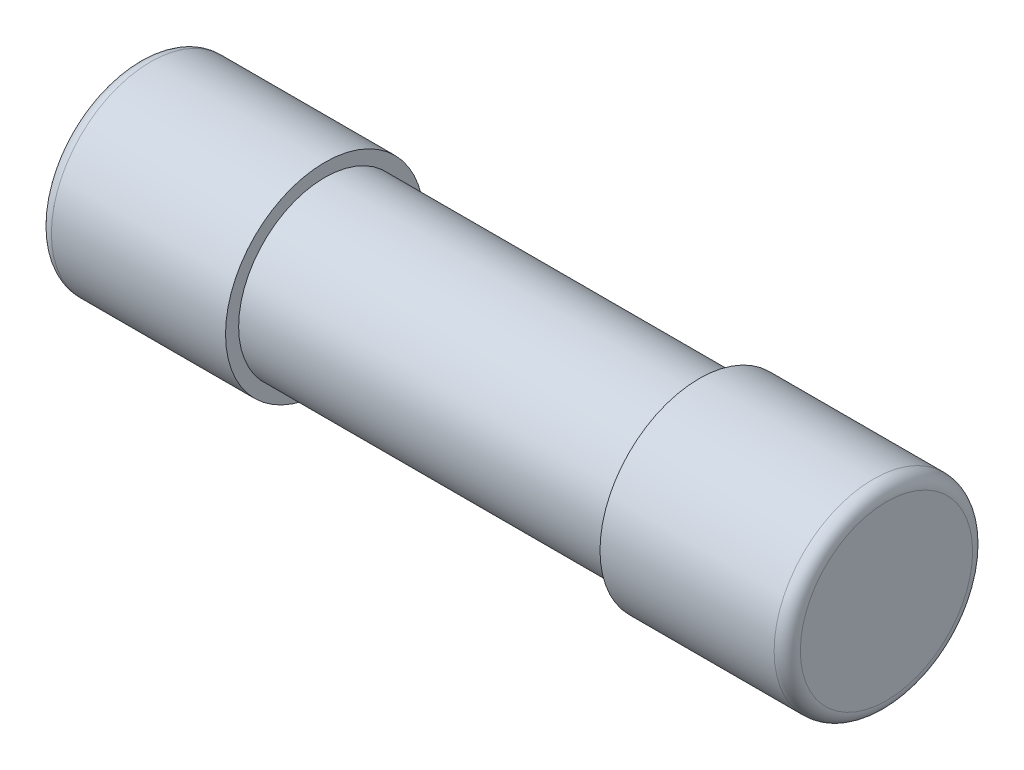
ISO-10303-21;
HEADER;
FILE_DESCRIPTION(('STEP AP214'),'2;1');
FILE_NAME('part.step','',(''),(''),'','','');
FILE_SCHEMA(('AUTOMOTIVE_DESIGN { 1 0 10303 214 1 1 1 1 }'));
ENDSEC;
DATA;
#1=APPLICATION_CONTEXT('core data for automotive mechanical design processes');
#2=APPLICATION_PROTOCOL_DEFINITION('international standard','automotive_design',2000,#1);
#3=PRODUCT_CONTEXT('',#1,'mechanical');
#4=PRODUCT('Part','Part','',(#3));
#5=PRODUCT_RELATED_PRODUCT_CATEGORY('part','',(#4));
#6=PRODUCT_DEFINITION_FORMATION('','',#4);
#7=PRODUCT_DEFINITION_CONTEXT('part definition',#1,'design');
#8=PRODUCT_DEFINITION('design','',#6,#7);
#9=PRODUCT_DEFINITION_SHAPE('','',#8);
#10=(LENGTH_UNIT() NAMED_UNIT(*) SI_UNIT(.MILLI.,.METRE.));
#11=(NAMED_UNIT(*) PLANE_ANGLE_UNIT() SI_UNIT($,.RADIAN.));
#12=(NAMED_UNIT(*) SI_UNIT($,.STERADIAN.) SOLID_ANGLE_UNIT());
#13=UNCERTAINTY_MEASURE_WITH_UNIT(LENGTH_MEASURE(1.E-05),#10,'distance_accuracy_value','');
#14=(GEOMETRIC_REPRESENTATION_CONTEXT(3) GLOBAL_UNCERTAINTY_ASSIGNED_CONTEXT((#13)) GLOBAL_UNIT_ASSIGNED_CONTEXT((#10,
#11,#12)) REPRESENTATION_CONTEXT('',''));
#15=CARTESIAN_POINT('',(0.,0.,0.));
#16=DIRECTION('',(0.,0.,1.));
#17=DIRECTION('',(1.,0.,0.));
#18=AXIS2_PLACEMENT_3D('',#15,#16,#17);
#19=CARTESIAN_POINT('',(-12.4483339199197,1.69430374057652,20.));
#20=DIRECTION('',(1.,0.,0.));
#21=DIRECTION('',(0.,0.,-1.));
#22=AXIS2_PLACEMENT_3D('',#19,#20,#21);
#23=TOROIDAL_SURFACE('',#22,2.3,0.35);
#24=CARTESIAN_POINT('',(-12.4483339199197,1.69430374057652,20.));
#25=DIRECTION('',(1.,0.,0.));
#26=DIRECTION('',(0.,0.,-1.));
#27=AXIS2_PLACEMENT_3D('',#24,#25,#26);
#28=CIRCLE('',#27,2.65);
#29=CARTESIAN_POINT('',(-12.4483339199197,1.69430374057652,17.35));
#30=VERTEX_POINT('',#29);
#31=CARTESIAN_POINT('',(-12.4483339199197,1.69430374057652,22.65));
#32=VERTEX_POINT('',#31);
#33=EDGE_CURVE('P0_E64',#30,#32,#28,.T.);
#34=ORIENTED_EDGE('',*,*,#33,.F.);
#35=CARTESIAN_POINT('',(-12.4483339199197,1.69430374057652,20.));
#36=DIRECTION('',(1.,0.,0.));
#37=DIRECTION('',(0.,0.,-1.));
#38=AXIS2_PLACEMENT_3D('',#35,#36,#37);
#39=CIRCLE('',#38,2.65);
#40=EDGE_CURVE('P0_E57',#32,#30,#39,.T.);
#41=ORIENTED_EDGE('',*,*,#40,.F.);
#42=CARTESIAN_POINT('',(-12.4483339199197,1.69430374057652,22.3));
#43=DIRECTION('',(0.,-1.,0.));
#44=DIRECTION('',(0.,0.,1.));
#45=AXIS2_PLACEMENT_3D('',#42,#43,#44);
#46=CIRCLE('',#45,0.35);
#47=CARTESIAN_POINT('',(-12.7983339199197,1.69430374057652,22.3));
#48=VERTEX_POINT('',#47);
#49=EDGE_CURVE('P0_E11',#32,#48,#46,.T.);
#50=ORIENTED_EDGE('',*,*,#49,.T.);
#51=CARTESIAN_POINT('',(-12.7983339199197,1.69430374057652,20.));
#52=DIRECTION('',(-1.,0.,0.));
#53=DIRECTION('',(0.,0.,-1.));
#54=AXIS2_PLACEMENT_3D('',#51,#52,#53);
#55=CIRCLE('',#54,2.3);
#56=EDGE_CURVE('P0_E25',#48,#48,#55,.T.);
#57=ORIENTED_EDGE('',*,*,#56,.F.);
#58=ORIENTED_EDGE('',*,*,#49,.F.);
#59=EDGE_LOOP('',(#34,#41,#50,#57,#58));
#60=FACE_BOUND('',#59,.T.);
#61=ADVANCED_FACE('P0_F17',(#60),#23,.T.);
#62=CARTESIAN_POINT('',(-12.7983339199197,-12.8144282326477,20.));
#63=DIRECTION('',(1.,0.,0.));
#64=DIRECTION('',(0.,1.,0.));
#65=AXIS2_PLACEMENT_3D('',#62,#63,#64);
#66=PLANE('',#65);
#67=ORIENTED_EDGE('',*,*,#56,.T.);
#68=EDGE_LOOP('',(#67));
#69=FACE_BOUND('',#68,.T.);
#70=ADVANCED_FACE('P0_F74',(#69),#66,.F.);
#71=CARTESIAN_POINT('',(-7.7983339199197,1.69430374057652,20.));
#72=DIRECTION('',(-1.,0.,0.));
#73=DIRECTION('',(0.,0.,1.));
#74=AXIS2_PLACEMENT_3D('',#71,#72,#73);
#75=CYLINDRICAL_SURFACE('',#74,2.65);
#76=ORIENTED_EDGE('',*,*,#33,.T.);
#77=ORIENTED_EDGE('',*,*,#40,.T.);
#78=DIRECTION('',(1.,0.,0.));
#79=VECTOR('',#78,1.);
#80=CARTESIAN_POINT('',(-7.7983339199197,1.69430374057652,17.35));
#81=LINE('',#80,#79);
#82=CARTESIAN_POINT('',(-7.7983339199197,1.69430374057652,17.35));
#83=VERTEX_POINT('',#82);
#84=EDGE_CURVE('P0_E52',#30,#83,#81,.T.);
#85=ORIENTED_EDGE('',*,*,#84,.T.);
#86=CARTESIAN_POINT('',(-7.7983339199197,1.69430374057652,20.));
#87=DIRECTION('',(-1.,0.,0.));
#88=DIRECTION('',(0.,0.,1.));
#89=AXIS2_PLACEMENT_3D('',#86,#87,#88);
#90=CIRCLE('',#89,2.65);
#91=EDGE_CURVE('P0_E56',#83,#83,#90,.T.);
#92=ORIENTED_EDGE('',*,*,#91,.T.);
#93=ORIENTED_EDGE('',*,*,#84,.F.);
#94=EDGE_LOOP('',(#76,#77,#85,#92,#93));
#95=FACE_BOUND('',#94,.T.);
#96=ADVANCED_FACE('P0_F54',(#95),#75,.T.);
#97=CARTESIAN_POINT('',(-7.7983339199197,-12.8144282326477,20.));
#98=DIRECTION('',(1.,0.,0.));
#99=DIRECTION('',(0.,1.,0.));
#100=AXIS2_PLACEMENT_3D('',#97,#98,#99);
#101=PLANE('',#100);
#102=ORIENTED_EDGE('',*,*,#91,.F.);
#103=EDGE_LOOP('',(#102));
#104=FACE_BOUND('',#103,.T.);
#105=ADVANCED_FACE('P0_F85',(#104),#101,.T.);
#106=CLOSED_SHELL('',(#61,#70,#96,#105));
#107=MANIFOLD_SOLID_BREP('P0_B1',#106);
#108=CARTESIAN_POINT('',(6.85166608008031,1.69430374057652,20.));
#109=DIRECTION('',(1.,0.,0.));
#110=DIRECTION('',(0.,0.,-1.));
#111=AXIS2_PLACEMENT_3D('',#108,#109,#110);
#112=TOROIDAL_SURFACE('',#111,2.3,0.35);
#113=CARTESIAN_POINT('',(7.20166608008031,1.69430374057652,20.));
#114=DIRECTION('',(1.,0.,0.));
#115=DIRECTION('',(0.,0.,-1.));
#116=AXIS2_PLACEMENT_3D('',#113,#114,#115);
#117=CIRCLE('',#116,2.3);
#118=CARTESIAN_POINT('',(7.20166608008031,1.69430374057652,22.3));
#119=VERTEX_POINT('',#118);
#120=EDGE_CURVE('P1_E51',#119,#119,#117,.T.);
#121=ORIENTED_EDGE('',*,*,#120,.F.);
#122=CARTESIAN_POINT('',(6.85166608008031,1.69430374057652,22.3));
#123=DIRECTION('',(0.,-1.,0.));
#124=DIRECTION('',(0.,0.,1.));
#125=AXIS2_PLACEMENT_3D('',#122,#123,#124);
#126=CIRCLE('',#125,0.35);
#127=CARTESIAN_POINT('',(6.85166608008031,1.69430374057652,22.65));
#128=VERTEX_POINT('',#127);
#129=EDGE_CURVE('P1_E11',#119,#128,#126,.T.);
#130=ORIENTED_EDGE('',*,*,#129,.T.);
#131=CARTESIAN_POINT('',(6.85166608008031,1.69430374057652,20.));
#132=DIRECTION('',(-1.,0.,0.));
#133=DIRECTION('',(0.,0.,-1.));
#134=AXIS2_PLACEMENT_3D('',#131,#132,#133);
#135=CIRCLE('',#134,2.65);
#136=CARTESIAN_POINT('',(6.85166608008031,1.69430374057652,17.35));
#137=VERTEX_POINT('',#136);
#138=EDGE_CURVE('P1_E66',#137,#128,#135,.T.);
#139=ORIENTED_EDGE('',*,*,#138,.F.);
#140=CARTESIAN_POINT('',(6.85166608008031,1.69430374057652,20.));
#141=DIRECTION('',(-1.,0.,0.));
#142=DIRECTION('',(0.,0.,-1.));
#143=AXIS2_PLACEMENT_3D('',#140,#141,#142);
#144=CIRCLE('',#143,2.65);
#145=EDGE_CURVE('P1_E25',#128,#137,#144,.T.);
#146=ORIENTED_EDGE('',*,*,#145,.F.);
#147=ORIENTED_EDGE('',*,*,#129,.F.);
#148=EDGE_LOOP('',(#121,#130,#139,#146,#147));
#149=FACE_BOUND('',#148,.T.);
#150=ADVANCED_FACE('P1_F17',(#149),#112,.T.);
#151=CARTESIAN_POINT('',(2.20166608008031,-12.8144282326477,20.));
#152=DIRECTION('',(1.,0.,0.));
#153=DIRECTION('',(0.,1.,0.));
#154=AXIS2_PLACEMENT_3D('',#151,#152,#153);
#155=PLANE('',#154);
#156=CARTESIAN_POINT('',(2.20166608008031,1.69430374057652,20.));
#157=DIRECTION('',(-1.,0.,0.));
#158=DIRECTION('',(0.,0.,1.));
#159=AXIS2_PLACEMENT_3D('',#156,#157,#158);
#160=CIRCLE('',#159,2.65);
#161=CARTESIAN_POINT('',(2.20166608008031,1.69430374057652,17.35));
#162=VERTEX_POINT('',#161);
#163=EDGE_CURVE('P1_E55',#162,#162,#160,.T.);
#164=ORIENTED_EDGE('',*,*,#163,.T.);
#165=EDGE_LOOP('',(#164));
#166=FACE_BOUND('',#165,.T.);
#167=ADVANCED_FACE('P1_F87',(#166),#155,.F.);
#168=CARTESIAN_POINT('',(-7.7983339199197,1.69430374057652,20.));
#169=DIRECTION('',(-1.,0.,0.));
#170=DIRECTION('',(0.,0.,1.));
#171=AXIS2_PLACEMENT_3D('',#168,#169,#170);
#172=CYLINDRICAL_SURFACE('',#171,2.65);
#173=ORIENTED_EDGE('',*,*,#163,.F.);
#174=DIRECTION('',(1.,0.,0.));
#175=VECTOR('',#174,1.);
#176=CARTESIAN_POINT('',(-7.7983339199197,1.69430374057652,17.35));
#177=LINE('',#176,#175);
#178=EDGE_CURVE('P1_E60',#162,#137,#177,.T.);
#179=ORIENTED_EDGE('',*,*,#178,.T.);
#180=ORIENTED_EDGE('',*,*,#138,.T.);
#181=ORIENTED_EDGE('',*,*,#145,.T.);
#182=ORIENTED_EDGE('',*,*,#178,.F.);
#183=EDGE_LOOP('',(#173,#179,#180,#181,#182));
#184=FACE_BOUND('',#183,.T.);
#185=ADVANCED_FACE('P1_F79',(#184),#172,.T.);
#186=CARTESIAN_POINT('',(7.20166608008031,-12.8144282326477,20.));
#187=DIRECTION('',(1.,0.,0.));
#188=DIRECTION('',(0.,1.,0.));
#189=AXIS2_PLACEMENT_3D('',#186,#187,#188);
#190=PLANE('',#189);
#191=ORIENTED_EDGE('',*,*,#120,.T.);
#192=EDGE_LOOP('',(#191));
#193=FACE_BOUND('',#192,.T.);
#194=ADVANCED_FACE('P1_F53',(#193),#190,.T.);
#195=CLOSED_SHELL('',(#150,#167,#185,#194));
#196=MANIFOLD_SOLID_BREP('P1_B1',#195);
#197=CARTESIAN_POINT('',(-7.7983339199197,-12.8144282326477,20.));
#198=DIRECTION('',(1.,0.,0.));
#199=DIRECTION('',(0.,1.,0.));
#200=AXIS2_PLACEMENT_3D('',#197,#198,#199);
#201=PLANE('',#200);
#202=CARTESIAN_POINT('',(-7.7983339199197,1.69430374057652,20.));
#203=DIRECTION('',(-1.,0.,0.));
#204=DIRECTION('',(0.,0.,1.));
#205=AXIS2_PLACEMENT_3D('',#202,#203,#204);
#206=CIRCLE('',#205,2.3);
#207=CARTESIAN_POINT('',(-7.7983339199197,1.69430374057652,17.7));
#208=VERTEX_POINT('',#207);
#209=EDGE_CURVE('P2_E26',#208,#208,#206,.T.);
#210=ORIENTED_EDGE('',*,*,#209,.T.);
#211=EDGE_LOOP('',(#210));
#212=FACE_BOUND('',#211,.T.);
#213=ADVANCED_FACE('P2_F17',(#212),#201,.F.);
#214=CARTESIAN_POINT('',(-7.7983339199197,1.69430374057652,20.));
#215=DIRECTION('',(-1.,0.,0.));
#216=DIRECTION('',(0.,0.,1.));
#217=AXIS2_PLACEMENT_3D('',#214,#215,#216);
#218=CYLINDRICAL_SURFACE('',#217,2.3);
#219=ORIENTED_EDGE('',*,*,#209,.F.);
#220=DIRECTION('',(1.,0.,0.));
#221=VECTOR('',#220,1.);
#222=CARTESIAN_POINT('',(-7.7983339199197,1.69430374057652,17.7));
#223=LINE('',#222,#221);
#224=CARTESIAN_POINT('',(2.20166608008031,1.69430374057652,17.7));
#225=VERTEX_POINT('',#224);
#226=EDGE_CURVE('P2_E11',#208,#225,#223,.T.);
#227=ORIENTED_EDGE('',*,*,#226,.T.);
#228=CARTESIAN_POINT('',(2.20166608008031,1.69430374057652,20.));
#229=DIRECTION('',(-1.,0.,0.));
#230=DIRECTION('',(0.,0.,1.));
#231=AXIS2_PLACEMENT_3D('',#228,#229,#230);
#232=CIRCLE('',#231,2.3);
#233=EDGE_CURVE('P2_E41',#225,#225,#232,.T.);
#234=ORIENTED_EDGE('',*,*,#233,.T.);
#235=ORIENTED_EDGE('',*,*,#226,.F.);
#236=EDGE_LOOP('',(#219,#227,#234,#235));
#237=FACE_BOUND('',#236,.T.);
#238=ADVANCED_FACE('P2_F39',(#237),#218,.T.);
#239=CARTESIAN_POINT('',(2.20166608008031,-12.8144282326477,20.));
#240=DIRECTION('',(1.,0.,0.));
#241=DIRECTION('',(0.,1.,0.));
#242=AXIS2_PLACEMENT_3D('',#239,#240,#241);
#243=PLANE('',#242);
#244=ORIENTED_EDGE('',*,*,#233,.F.);
#245=EDGE_LOOP('',(#244));
#246=FACE_BOUND('',#245,.T.);
#247=ADVANCED_FACE('P2_F52',(#246),#243,.T.);
#248=CLOSED_SHELL('',(#213,#238,#247));
#249=MANIFOLD_SOLID_BREP('P2_B1',#248);
#250=CARTESIAN_POINT('',(-7.7983339199197,-12.8144282326477,20.));
#251=DIRECTION('',(1.,0.,0.));
#252=DIRECTION('',(0.,1.,0.));
#253=AXIS2_PLACEMENT_3D('',#250,#251,#252);
#254=PLANE('',#253);
#255=CARTESIAN_POINT('',(-7.7983339199197,1.69430374057652,20.));
#256=DIRECTION('',(1.,0.,0.));
#257=DIRECTION('',(0.,0.,-1.));
#258=AXIS2_PLACEMENT_3D('',#255,#256,#257);
#259=CIRCLE('',#258,0.25);
#260=CARTESIAN_POINT('',(-7.7983339199197,1.69430374057652,20.25));
#261=VERTEX_POINT('',#260);
#262=EDGE_CURVE('P3_E11',#261,#261,#259,.T.);
#263=ORIENTED_EDGE('',*,*,#262,.F.);
#264=EDGE_LOOP('',(#263));
#265=FACE_BOUND('',#264,.T.);
#266=ADVANCED_FACE('P3_F17',(#265),#254,.F.);
#267=CARTESIAN_POINT('',(-8.50544070110624,1.69430374057652,20.));
#268=DIRECTION('',(1.,0.,0.));
#269=DIRECTION('',(0.,0.,-1.));
#270=AXIS2_PLACEMENT_3D('',#267,#268,#269);
#271=CYLINDRICAL_SURFACE('',#270,0.25);
#272=CARTESIAN_POINT('',(2.20166608008031,1.69430374057652,20.));
#273=DIRECTION('',(-1.,0.,0.));
#274=DIRECTION('',(0.,0.,1.));
#275=AXIS2_PLACEMENT_3D('',#272,#273,#274);
#276=CIRCLE('',#275,0.25);
#277=CARTESIAN_POINT('',(2.20166608008031,1.69430374057652,20.25));
#278=VERTEX_POINT('',#277);
#279=EDGE_CURVE('P3_E41',#278,#278,#276,.T.);
#280=ORIENTED_EDGE('',*,*,#279,.T.);
#281=DIRECTION('',(-1.,0.,0.));
#282=VECTOR('',#281,1.);
#283=CARTESIAN_POINT('',(-8.50544070110624,1.69430374057652,20.25));
#284=LINE('',#283,#282);
#285=EDGE_CURVE('P3_E26',#278,#261,#284,.T.);
#286=ORIENTED_EDGE('',*,*,#285,.T.);
#287=ORIENTED_EDGE('',*,*,#262,.T.);
#288=ORIENTED_EDGE('',*,*,#285,.F.);
#289=EDGE_LOOP('',(#280,#286,#287,#288));
#290=FACE_BOUND('',#289,.T.);
#291=ADVANCED_FACE('P3_F19',(#290),#271,.T.);
#292=CARTESIAN_POINT('',(2.20166608008031,1.69430374057652,20.));
#293=DIRECTION('',(-1.,0.,0.));
#294=DIRECTION('',(0.,0.,1.));
#295=AXIS2_PLACEMENT_3D('',#292,#293,#294);
#296=PLANE('',#295);
#297=ORIENTED_EDGE('',*,*,#279,.F.);
#298=EDGE_LOOP('',(#297));
#299=FACE_BOUND('',#298,.T.);
#300=ADVANCED_FACE('P3_F51',(#299),#296,.F.);
#301=CLOSED_SHELL('',(#266,#291,#300));
#302=MANIFOLD_SOLID_BREP('P3_B1',#301);
#303=ADVANCED_BREP_SHAPE_REPRESENTATION('',(#18,#107,#196,#249,#302),#14);
#304=SHAPE_DEFINITION_REPRESENTATION(#9,#303);
ENDSEC;
END-ISO-10303-21;
